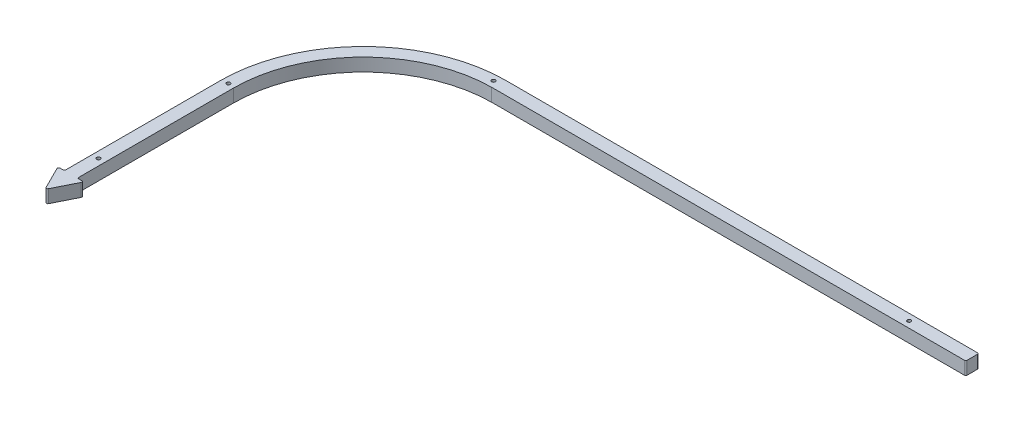
ISO-10303-21;
HEADER;
FILE_DESCRIPTION(('STEP AP214'),'2;1');
FILE_NAME('part.step','',(''),(''),'','','');
FILE_SCHEMA(('AUTOMOTIVE_DESIGN { 1 0 10303 214 1 1 1 1 }'));
ENDSEC;
DATA;
#1=APPLICATION_CONTEXT('core data for automotive mechanical design processes');
#2=APPLICATION_PROTOCOL_DEFINITION('international standard','automotive_design',2000,#1);
#3=PRODUCT_CONTEXT('',#1,'mechanical');
#4=PRODUCT('Part','Part','',(#3));
#5=PRODUCT_RELATED_PRODUCT_CATEGORY('part','',(#4));
#6=PRODUCT_DEFINITION_FORMATION('','',#4);
#7=PRODUCT_DEFINITION_CONTEXT('part definition',#1,'design');
#8=PRODUCT_DEFINITION('design','',#6,#7);
#9=PRODUCT_DEFINITION_SHAPE('','',#8);
#10=(LENGTH_UNIT() NAMED_UNIT(*) SI_UNIT(.MILLI.,.METRE.));
#11=(NAMED_UNIT(*) PLANE_ANGLE_UNIT() SI_UNIT($,.RADIAN.));
#12=(NAMED_UNIT(*) SI_UNIT($,.STERADIAN.) SOLID_ANGLE_UNIT());
#13=UNCERTAINTY_MEASURE_WITH_UNIT(LENGTH_MEASURE(1.E-05),#10,'distance_accuracy_value','');
#14=(GEOMETRIC_REPRESENTATION_CONTEXT(3) GLOBAL_UNCERTAINTY_ASSIGNED_CONTEXT((#13)) GLOBAL_UNIT_ASSIGNED_CONTEXT((#10,
#11,#12)) REPRESENTATION_CONTEXT('',''));
#15=CARTESIAN_POINT('',(0.,0.,0.));
#16=DIRECTION('',(0.,0.,1.));
#17=DIRECTION('',(1.,0.,0.));
#18=AXIS2_PLACEMENT_3D('',#15,#16,#17);
#19=CARTESIAN_POINT('',(0.,6.35,0.));
#20=DIRECTION('',(0.,1.,0.));
#21=DIRECTION('',(0.,0.,1.));
#22=AXIS2_PLACEMENT_3D('',#19,#20,#21);
#23=PLANE('',#22);
#24=CARTESIAN_POINT('',(3.175,6.35,-26.1849031657124));
#25=DIRECTION('',(0.,1.,0.));
#26=DIRECTION('',(0.,0.,1.));
#27=AXIS2_PLACEMENT_3D('',#24,#25,#26);
#28=CIRCLE('',#27,0.889000000000001);
#29=CARTESIAN_POINT('',(3.175,6.35,-25.2959031657124));
#30=VERTEX_POINT('',#29);
#31=EDGE_CURVE('E358',#30,#30,#28,.T.);
#32=ORIENTED_EDGE('',*,*,#31,.F.);
#33=EDGE_LOOP('',(#32));
#34=FACE_BOUND('',#33,.T.);
#35=CARTESIAN_POINT('',(3.17499999999978,6.35,-89.6849031657124));
#36=DIRECTION('',(0.,1.,0.));
#37=DIRECTION('',(0.,0.,1.));
#38=AXIS2_PLACEMENT_3D('',#35,#36,#37);
#39=CIRCLE('',#38,0.888999999999999);
#40=CARTESIAN_POINT('',(3.17499999999978,6.35,-88.7959031657124));
#41=VERTEX_POINT('',#40);
#42=EDGE_CURVE('E352',#41,#41,#39,.T.);
#43=ORIENTED_EDGE('',*,*,#42,.F.);
#44=EDGE_LOOP('',(#43));
#45=FACE_BOUND('',#44,.T.);
#46=CARTESIAN_POINT('',(66.8019999999998,6.35,-155.570446754539));
#47=DIRECTION('',(0.,1.,0.));
#48=DIRECTION('',(0.,0.,1.));
#49=AXIS2_PLACEMENT_3D('',#46,#47,#48);
#50=CIRCLE('',#49,0.889000000000006);
#51=CARTESIAN_POINT('',(66.8019999999998,6.35,-154.681446754539));
#52=VERTEX_POINT('',#51);
#53=EDGE_CURVE('E346',#52,#52,#50,.T.);
#54=ORIENTED_EDGE('',*,*,#53,.F.);
#55=EDGE_LOOP('',(#54));
#56=FACE_BOUND('',#55,.T.);
#57=CARTESIAN_POINT('',(270.002,6.35,-155.570446754539));
#58=DIRECTION('',(0.,1.,0.));
#59=DIRECTION('',(0.,0.,1.));
#60=AXIS2_PLACEMENT_3D('',#57,#58,#59);
#61=CIRCLE('',#60,0.888999999999993);
#62=CARTESIAN_POINT('',(270.002,6.35,-154.681446754539));
#63=VERTEX_POINT('',#62);
#64=EDGE_CURVE('E340',#63,#63,#61,.T.);
#65=ORIENTED_EDGE('',*,*,#64,.F.);
#66=EDGE_LOOP('',(#65));
#67=FACE_BOUND('',#66,.T.);
#68=DIRECTION('',(0.,0.,1.));
#69=VECTOR('',#68,1.);
#70=CARTESIAN_POINT('',(300.846682844601,6.35,0.));
#71=LINE('',#70,#69);
#72=CARTESIAN_POINT('',(300.846682844601,6.35,-158.11066359056));
#73=VERTEX_POINT('',#72);
#74=CARTESIAN_POINT('',(300.846682844601,6.35,-153.030229918519));
#75=VERTEX_POINT('',#74);
#76=EDGE_CURVE('E206',#73,#75,#71,.T.);
#77=ORIENTED_EDGE('',*,*,#76,.F.);
#78=CARTESIAN_POINT('',(300.211682844601,6.35,-158.11066359056));
#79=DIRECTION('',(0.,1.,0.));
#80=DIRECTION('',(0.,0.,1.));
#81=AXIS2_PLACEMENT_3D('',#78,#79,#80);
#82=CIRCLE('',#81,0.635);
#83=CARTESIAN_POINT('',(300.211682844601,6.35,-158.74566359056));
#84=VERTEX_POINT('',#83);
#85=EDGE_CURVE('E274',#73,#84,#82,.T.);
#86=ORIENTED_EDGE('',*,*,#85,.T.);
#87=DIRECTION('',(1.,0.,0.));
#88=VECTOR('',#87,1.);
#89=CARTESIAN_POINT('',(0.,6.35,-158.745663590559));
#90=LINE('',#89,#88);
#91=CARTESIAN_POINT('',(69.071682844601,6.35,-158.745663590559));
#92=VERTEX_POINT('',#91);
#93=EDGE_CURVE('E212',#92,#84,#90,.T.);
#94=ORIENTED_EDGE('',*,*,#93,.F.);
#95=CARTESIAN_POINT('',(69.85,6.35,-88.9));
#96=DIRECTION('',(0.,1.,0.));
#97=DIRECTION('',(0.,0.,1.));
#98=AXIS2_PLACEMENT_3D('',#95,#96,#97);
#99=CIRCLE('',#98,69.85);
#100=CARTESIAN_POINT('',(0.,6.35,-88.9));
#101=VERTEX_POINT('',#100);
#102=EDGE_CURVE('E215',#101,#92,#99,.F.);
#103=ORIENTED_EDGE('',*,*,#102,.F.);
#104=DIRECTION('',(0.,0.,-1.));
#105=VECTOR('',#104,1.);
#106=CARTESIAN_POINT('',(0.,6.35,0.));
#107=LINE('',#106,#105);
#108=CARTESIAN_POINT('',(0.,6.35,-13.335));
#109=VERTEX_POINT('',#108);
#110=EDGE_CURVE('E218',#109,#101,#107,.T.);
#111=ORIENTED_EDGE('',*,*,#110,.F.);
#112=CARTESIAN_POINT('',(-0.635,6.35,-13.335));
#113=DIRECTION('',(0.,1.,0.));
#114=DIRECTION('',(0.,0.,1.));
#115=AXIS2_PLACEMENT_3D('',#112,#113,#114);
#116=CIRCLE('',#115,0.635);
#117=CARTESIAN_POINT('',(-0.635,6.35,-12.7));
#118=VERTEX_POINT('',#117);
#119=EDGE_CURVE('E12',#109,#118,#116,.F.);
#120=ORIENTED_EDGE('',*,*,#119,.T.);
#121=DIRECTION('',(-1.,0.,0.));
#122=VECTOR('',#121,1.);
#123=CARTESIAN_POINT('',(9.525,6.35,-12.7));
#124=LINE('',#123,#122);
#125=CARTESIAN_POINT('',(-2.14754841714382,6.35,-12.7));
#126=VERTEX_POINT('',#125);
#127=EDGE_CURVE('E243',#118,#126,#124,.T.);
#128=ORIENTED_EDGE('',*,*,#127,.T.);
#129=CARTESIAN_POINT('',(-2.14754841714382,6.35,-12.065));
#130=DIRECTION('',(0.,1.,0.));
#131=DIRECTION('',(0.,0.,1.));
#132=AXIS2_PLACEMENT_3D('',#129,#130,#131);
#133=CIRCLE('',#132,0.635);
#134=CARTESIAN_POINT('',(-2.71550968342876,6.35,-11.7810193668575));
#135=VERTEX_POINT('',#134);
#136=EDGE_CURVE('E270',#126,#135,#133,.T.);
#137=ORIENTED_EDGE('',*,*,#136,.T.);
#138=DIRECTION('',(0.447213595499958,0.,0.894427190999916));
#139=VECTOR('',#138,1.);
#140=CARTESIAN_POINT('',(2.54,6.35,-1.27));
#141=LINE('',#140,#139);
#142=CARTESIAN_POINT('',(2.60703873371505,6.35,-1.13592253256989));
#143=VERTEX_POINT('',#142);
#144=EDGE_CURVE('E328',#135,#143,#141,.T.);
#145=ORIENTED_EDGE('',*,*,#144,.T.);
#146=CARTESIAN_POINT('',(3.175,6.35,-1.41990316571237));
#147=DIRECTION('',(0.,1.,0.));
#148=DIRECTION('',(0.,0.,1.));
#149=AXIS2_PLACEMENT_3D('',#146,#147,#148);
#150=CIRCLE('',#149,0.635);
#151=CARTESIAN_POINT('',(3.74296126628495,6.35,-1.13592253256989));
#152=VERTEX_POINT('',#151);
#153=EDGE_CURVE('E266',#143,#152,#150,.T.);
#154=ORIENTED_EDGE('',*,*,#153,.T.);
#155=DIRECTION('',(0.447213595499958,0.,-0.894427190999916));
#156=VECTOR('',#155,1.);
#157=CARTESIAN_POINT('',(2.54,6.35,1.27));
#158=LINE('',#157,#156);
#159=CARTESIAN_POINT('',(9.06550968342877,6.35,-11.7810193668575));
#160=VERTEX_POINT('',#159);
#161=EDGE_CURVE('E334',#152,#160,#158,.T.);
#162=ORIENTED_EDGE('',*,*,#161,.T.);
#163=CARTESIAN_POINT('',(8.49754841714381,6.35,-12.065));
#164=DIRECTION('',(0.,1.,0.));
#165=DIRECTION('',(0.,0.,1.));
#166=AXIS2_PLACEMENT_3D('',#163,#164,#165);
#167=CIRCLE('',#166,0.635);
#168=CARTESIAN_POINT('',(8.49754841714381,6.35,-12.7));
#169=VERTEX_POINT('',#168);
#170=EDGE_CURVE('E268',#160,#169,#167,.T.);
#171=ORIENTED_EDGE('',*,*,#170,.T.);
#172=CARTESIAN_POINT('',(6.985,6.35,-12.7));
#173=VERTEX_POINT('',#172);
#174=EDGE_CURVE('E223',#169,#173,#124,.T.);
#175=ORIENTED_EDGE('',*,*,#174,.T.);
#176=CARTESIAN_POINT('',(6.985,6.35,-13.335));
#177=DIRECTION('',(0.,1.,0.));
#178=DIRECTION('',(0.,0.,1.));
#179=AXIS2_PLACEMENT_3D('',#176,#177,#178);
#180=CIRCLE('',#179,0.635);
#181=CARTESIAN_POINT('',(6.35,6.35,-13.335));
#182=VERTEX_POINT('',#181);
#183=EDGE_CURVE('E185',#173,#182,#180,.F.);
#184=ORIENTED_EDGE('',*,*,#183,.T.);
#185=DIRECTION('',(0.,0.,-1.));
#186=VECTOR('',#185,1.);
#187=CARTESIAN_POINT('',(6.35,6.35,0.));
#188=LINE('',#187,#186);
#189=CARTESIAN_POINT('',(6.35,6.35,-88.9));
#190=VERTEX_POINT('',#189);
#191=EDGE_CURVE('E176',#182,#190,#188,.T.);
#192=ORIENTED_EDGE('',*,*,#191,.T.);
#193=CARTESIAN_POINT('',(69.85,6.35,-88.9));
#194=DIRECTION('',(0.,1.,0.));
#195=DIRECTION('',(0.,0.,1.));
#196=AXIS2_PLACEMENT_3D('',#193,#194,#195);
#197=CIRCLE('',#196,63.5);
#198=CARTESIAN_POINT('',(69.071682844601,6.35,-152.395229918519));
#199=VERTEX_POINT('',#198);
#200=EDGE_CURVE('E181',#190,#199,#197,.F.);
#201=ORIENTED_EDGE('',*,*,#200,.T.);
#202=DIRECTION('',(1.,0.,0.));
#203=VECTOR('',#202,1.);
#204=CARTESIAN_POINT('',(0.,6.35,-152.395229918519));
#205=LINE('',#204,#203);
#206=CARTESIAN_POINT('',(300.211682844601,6.35,-152.395229918519));
#207=VERTEX_POINT('',#206);
#208=EDGE_CURVE('E204',#199,#207,#205,.T.);
#209=ORIENTED_EDGE('',*,*,#208,.T.);
#210=CARTESIAN_POINT('',(300.211682844601,6.35,-153.030229918519));
#211=DIRECTION('',(0.,1.,0.));
#212=DIRECTION('',(0.,0.,1.));
#213=AXIS2_PLACEMENT_3D('',#210,#211,#212);
#214=CIRCLE('',#213,0.635);
#215=EDGE_CURVE('E272',#207,#75,#214,.T.);
#216=ORIENTED_EDGE('',*,*,#215,.T.);
#217=EDGE_LOOP('',(#77,#86,#94,#103,#111,#120,#128,#137,#145,#154,#162,#171,#175,#184,#192,#201,
#209,#216));
#218=FACE_BOUND('',#217,.T.);
#219=ADVANCED_FACE('F53',(#34,#45,#56,#67,#218),#23,.T.);
#220=CARTESIAN_POINT('',(0.,0.,0.));
#221=DIRECTION('',(0.,1.,0.));
#222=DIRECTION('',(0.,0.,1.));
#223=AXIS2_PLACEMENT_3D('',#220,#221,#222);
#224=PLANE('',#223);
#225=CARTESIAN_POINT('',(3.175,0.,-26.1849031657124));
#226=DIRECTION('',(0.,1.,0.));
#227=DIRECTION('',(0.,0.,1.));
#228=AXIS2_PLACEMENT_3D('',#225,#226,#227);
#229=CIRCLE('',#228,0.889000000000001);
#230=CARTESIAN_POINT('',(3.175,0.,-25.2959031657124));
#231=VERTEX_POINT('',#230);
#232=EDGE_CURVE('E337',#231,#231,#229,.T.);
#233=ORIENTED_EDGE('',*,*,#232,.T.);
#234=EDGE_LOOP('',(#233));
#235=FACE_BOUND('',#234,.T.);
#236=CARTESIAN_POINT('',(3.17499999999978,0.,-89.6849031657124));
#237=DIRECTION('',(0.,1.,0.));
#238=DIRECTION('',(0.,0.,1.));
#239=AXIS2_PLACEMENT_3D('',#236,#237,#238);
#240=CIRCLE('',#239,0.888999999999999);
#241=CARTESIAN_POINT('',(3.17499999999978,0.,-88.7959031657124));
#242=VERTEX_POINT('',#241);
#243=EDGE_CURVE('E355',#242,#242,#240,.T.);
#244=ORIENTED_EDGE('',*,*,#243,.T.);
#245=EDGE_LOOP('',(#244));
#246=FACE_BOUND('',#245,.T.);
#247=CARTESIAN_POINT('',(66.8019999999998,0.,-155.570446754539));
#248=DIRECTION('',(0.,1.,0.));
#249=DIRECTION('',(0.,0.,1.));
#250=AXIS2_PLACEMENT_3D('',#247,#248,#249);
#251=CIRCLE('',#250,0.889000000000006);
#252=CARTESIAN_POINT('',(66.8019999999998,0.,-154.681446754539));
#253=VERTEX_POINT('',#252);
#254=EDGE_CURVE('E349',#253,#253,#251,.T.);
#255=ORIENTED_EDGE('',*,*,#254,.T.);
#256=EDGE_LOOP('',(#255));
#257=FACE_BOUND('',#256,.T.);
#258=CARTESIAN_POINT('',(270.002,0.,-155.570446754539));
#259=DIRECTION('',(0.,1.,0.));
#260=DIRECTION('',(0.,0.,1.));
#261=AXIS2_PLACEMENT_3D('',#258,#259,#260);
#262=CIRCLE('',#261,0.888999999999993);
#263=CARTESIAN_POINT('',(270.002,0.,-154.681446754539));
#264=VERTEX_POINT('',#263);
#265=EDGE_CURVE('E343',#264,#264,#262,.T.);
#266=ORIENTED_EDGE('',*,*,#265,.T.);
#267=EDGE_LOOP('',(#266));
#268=FACE_BOUND('',#267,.T.);
#269=DIRECTION('',(1.,0.,0.));
#270=VECTOR('',#269,1.);
#271=CARTESIAN_POINT('',(0.,0.,-158.745663590559));
#272=LINE('',#271,#270);
#273=CARTESIAN_POINT('',(69.071682844601,0.,-158.745663590559));
#274=VERTEX_POINT('',#273);
#275=CARTESIAN_POINT('',(300.211682844601,0.,-158.74566359056));
#276=VERTEX_POINT('',#275);
#277=EDGE_CURVE('E231',#274,#276,#272,.T.);
#278=ORIENTED_EDGE('',*,*,#277,.T.);
#279=CARTESIAN_POINT('',(300.211682844601,0.,-158.11066359056));
#280=DIRECTION('',(0.,1.,0.));
#281=DIRECTION('',(0.,0.,1.));
#282=AXIS2_PLACEMENT_3D('',#279,#280,#281);
#283=CIRCLE('',#282,0.635);
#284=CARTESIAN_POINT('',(300.846682844601,0.,-158.11066359056));
#285=VERTEX_POINT('',#284);
#286=EDGE_CURVE('E259',#276,#285,#283,.F.);
#287=ORIENTED_EDGE('',*,*,#286,.T.);
#288=DIRECTION('',(0.,0.,1.));
#289=VECTOR('',#288,1.);
#290=CARTESIAN_POINT('',(300.846682844601,0.,0.));
#291=LINE('',#290,#289);
#292=CARTESIAN_POINT('',(300.846682844601,0.,-153.030229918519));
#293=VERTEX_POINT('',#292);
#294=EDGE_CURVE('E228',#285,#293,#291,.T.);
#295=ORIENTED_EDGE('',*,*,#294,.T.);
#296=CARTESIAN_POINT('',(300.211682844601,0.,-153.030229918519));
#297=DIRECTION('',(0.,1.,0.));
#298=DIRECTION('',(0.,0.,1.));
#299=AXIS2_PLACEMENT_3D('',#296,#297,#298);
#300=CIRCLE('',#299,0.635);
#301=CARTESIAN_POINT('',(300.211682844601,0.,-152.395229918519));
#302=VERTEX_POINT('',#301);
#303=EDGE_CURVE('E257',#293,#302,#300,.F.);
#304=ORIENTED_EDGE('',*,*,#303,.T.);
#305=DIRECTION('',(1.,0.,0.));
#306=VECTOR('',#305,1.);
#307=CARTESIAN_POINT('',(0.,0.,-152.395229918519));
#308=LINE('',#307,#306);
#309=CARTESIAN_POINT('',(69.071682844601,0.,-152.395229918519));
#310=VERTEX_POINT('',#309);
#311=EDGE_CURVE('E225',#310,#302,#308,.T.);
#312=ORIENTED_EDGE('',*,*,#311,.F.);
#313=CARTESIAN_POINT('',(69.85,0.,-88.9));
#314=DIRECTION('',(0.,1.,0.));
#315=DIRECTION('',(0.,0.,1.));
#316=AXIS2_PLACEMENT_3D('',#313,#314,#315);
#317=CIRCLE('',#316,63.5);
#318=CARTESIAN_POINT('',(6.35,0.,-88.9));
#319=VERTEX_POINT('',#318);
#320=EDGE_CURVE('E222',#319,#310,#317,.F.);
#321=ORIENTED_EDGE('',*,*,#320,.F.);
#322=DIRECTION('',(0.,0.,-1.));
#323=VECTOR('',#322,1.);
#324=CARTESIAN_POINT('',(6.35,0.,0.));
#325=LINE('',#324,#323);
#326=CARTESIAN_POINT('',(6.35,0.,-13.335));
#327=VERTEX_POINT('',#326);
#328=EDGE_CURVE('E195',#327,#319,#325,.T.);
#329=ORIENTED_EDGE('',*,*,#328,.F.);
#330=CARTESIAN_POINT('',(6.985,0.,-13.335));
#331=DIRECTION('',(0.,1.,0.));
#332=DIRECTION('',(0.,0.,1.));
#333=AXIS2_PLACEMENT_3D('',#330,#331,#332);
#334=CIRCLE('',#333,0.635);
#335=CARTESIAN_POINT('',(6.985,0.,-12.7));
#336=VERTEX_POINT('',#335);
#337=EDGE_CURVE('E301',#327,#336,#334,.T.);
#338=ORIENTED_EDGE('',*,*,#337,.T.);
#339=DIRECTION('',(-1.,0.,0.));
#340=VECTOR('',#339,1.);
#341=CARTESIAN_POINT('',(9.525,0.,-12.7));
#342=LINE('',#341,#340);
#343=CARTESIAN_POINT('',(8.49754841714381,0.,-12.7));
#344=VERTEX_POINT('',#343);
#345=EDGE_CURVE('E245',#344,#336,#342,.T.);
#346=ORIENTED_EDGE('',*,*,#345,.F.);
#347=CARTESIAN_POINT('',(8.49754841714381,0.,-12.065));
#348=DIRECTION('',(0.,1.,0.));
#349=DIRECTION('',(0.,0.,1.));
#350=AXIS2_PLACEMENT_3D('',#347,#348,#349);
#351=CIRCLE('',#350,0.635);
#352=CARTESIAN_POINT('',(9.06550968342877,0.,-11.7810193668575));
#353=VERTEX_POINT('',#352);
#354=EDGE_CURVE('E253',#344,#353,#351,.F.);
#355=ORIENTED_EDGE('',*,*,#354,.T.);
#356=DIRECTION('',(0.447213595499958,0.,-0.894427190999916));
#357=VECTOR('',#356,1.);
#358=CARTESIAN_POINT('',(2.54,0.,1.27));
#359=LINE('',#358,#357);
#360=CARTESIAN_POINT('',(3.74296126628495,0.,-1.13592253256989));
#361=VERTEX_POINT('',#360);
#362=EDGE_CURVE('E332',#361,#353,#359,.T.);
#363=ORIENTED_EDGE('',*,*,#362,.F.);
#364=CARTESIAN_POINT('',(3.175,0.,-1.41990316571237));
#365=DIRECTION('',(0.,1.,0.));
#366=DIRECTION('',(0.,0.,1.));
#367=AXIS2_PLACEMENT_3D('',#364,#365,#366);
#368=CIRCLE('',#367,0.635);
#369=CARTESIAN_POINT('',(2.60703873371505,0.,-1.13592253256989));
#370=VERTEX_POINT('',#369);
#371=EDGE_CURVE('E251',#361,#370,#368,.F.);
#372=ORIENTED_EDGE('',*,*,#371,.T.);
#373=DIRECTION('',(0.447213595499958,0.,0.894427190999916));
#374=VECTOR('',#373,1.);
#375=CARTESIAN_POINT('',(2.54,0.,-1.27));
#376=LINE('',#375,#374);
#377=CARTESIAN_POINT('',(-2.71550968342876,0.,-11.7810193668575));
#378=VERTEX_POINT('',#377);
#379=EDGE_CURVE('E326',#378,#370,#376,.T.);
#380=ORIENTED_EDGE('',*,*,#379,.F.);
#381=CARTESIAN_POINT('',(-2.14754841714382,0.,-12.065));
#382=DIRECTION('',(0.,1.,0.));
#383=DIRECTION('',(0.,0.,1.));
#384=AXIS2_PLACEMENT_3D('',#381,#382,#383);
#385=CIRCLE('',#384,0.635);
#386=CARTESIAN_POINT('',(-2.14754841714382,0.,-12.7));
#387=VERTEX_POINT('',#386);
#388=EDGE_CURVE('E255',#378,#387,#385,.F.);
#389=ORIENTED_EDGE('',*,*,#388,.T.);
#390=CARTESIAN_POINT('',(-0.635,0.,-12.7));
#391=VERTEX_POINT('',#390);
#392=EDGE_CURVE('E248',#391,#387,#342,.T.);
#393=ORIENTED_EDGE('',*,*,#392,.F.);
#394=CARTESIAN_POINT('',(-0.635,0.,-13.335));
#395=DIRECTION('',(0.,1.,0.));
#396=DIRECTION('',(0.,0.,1.));
#397=AXIS2_PLACEMENT_3D('',#394,#395,#396);
#398=CIRCLE('',#397,0.635);
#399=CARTESIAN_POINT('',(0.,0.,-13.335));
#400=VERTEX_POINT('',#399);
#401=EDGE_CURVE('E61',#391,#400,#398,.T.);
#402=ORIENTED_EDGE('',*,*,#401,.T.);
#403=DIRECTION('',(0.,0.,-1.));
#404=VECTOR('',#403,1.);
#405=CARTESIAN_POINT('',(0.,0.,0.));
#406=LINE('',#405,#404);
#407=CARTESIAN_POINT('',(0.,0.,-88.9));
#408=VERTEX_POINT('',#407);
#409=EDGE_CURVE('E189',#400,#408,#406,.T.);
#410=ORIENTED_EDGE('',*,*,#409,.T.);
#411=CARTESIAN_POINT('',(69.85,0.,-88.9));
#412=DIRECTION('',(0.,1.,0.));
#413=DIRECTION('',(0.,0.,1.));
#414=AXIS2_PLACEMENT_3D('',#411,#412,#413);
#415=CIRCLE('',#414,69.85);
#416=EDGE_CURVE('E234',#408,#274,#415,.F.);
#417=ORIENTED_EDGE('',*,*,#416,.T.);
#418=EDGE_LOOP('',(#278,#287,#295,#304,#312,#321,#329,#338,#346,#355,#363,#372,#380,#389,#393,
#402,#410,#417));
#419=FACE_BOUND('',#418,.T.);
#420=ADVANCED_FACE('F306',(#235,#246,#257,#268,#419),#224,.F.);
#421=CARTESIAN_POINT('',(6.35,6.35,0.));
#422=DIRECTION('',(-1.,0.,0.));
#423=DIRECTION('',(0.,0.,1.));
#424=AXIS2_PLACEMENT_3D('',#421,#422,#423);
#425=PLANE('',#424);
#426=ORIENTED_EDGE('',*,*,#191,.F.);
#427=DIRECTION('',(0.,-1.,0.));
#428=VECTOR('',#427,1.);
#429=CARTESIAN_POINT('',(6.35,0.,-13.335));
#430=LINE('',#429,#428);
#431=EDGE_CURVE('E278',#182,#327,#430,.T.);
#432=ORIENTED_EDGE('',*,*,#431,.T.);
#433=ORIENTED_EDGE('',*,*,#328,.T.);
#434=DIRECTION('',(0.,-1.,0.));
#435=VECTOR('',#434,1.);
#436=CARTESIAN_POINT('',(6.35,6.35,-88.9));
#437=LINE('',#436,#435);
#438=EDGE_CURVE('E192',#190,#319,#437,.T.);
#439=ORIENTED_EDGE('',*,*,#438,.F.);
#440=EDGE_LOOP('',(#426,#432,#433,#439));
#441=FACE_BOUND('',#440,.T.);
#442=ADVANCED_FACE('F193',(#441),#425,.F.);
#443=CARTESIAN_POINT('',(69.85,6.35,-88.9));
#444=DIRECTION('',(0.,-1.,0.));
#445=DIRECTION('',(0.,0.,-1.));
#446=AXIS2_PLACEMENT_3D('',#443,#444,#445);
#447=CYLINDRICAL_SURFACE('',#446,63.5);
#448=ORIENTED_EDGE('',*,*,#320,.T.);
#449=DIRECTION('',(0.,-1.,0.));
#450=VECTOR('',#449,1.);
#451=CARTESIAN_POINT('',(69.071682844601,6.35,-152.395229918519));
#452=LINE('',#451,#450);
#453=EDGE_CURVE('E199',#199,#310,#452,.T.);
#454=ORIENTED_EDGE('',*,*,#453,.F.);
#455=ORIENTED_EDGE('',*,*,#200,.F.);
#456=ORIENTED_EDGE('',*,*,#438,.T.);
#457=EDGE_LOOP('',(#448,#454,#455,#456));
#458=FACE_BOUND('',#457,.T.);
#459=ADVANCED_FACE('F201',(#458),#447,.F.);
#460=CARTESIAN_POINT('',(0.,6.35,-152.395229918519));
#461=DIRECTION('',(0.,0.,-1.));
#462=DIRECTION('',(-1.,0.,0.));
#463=AXIS2_PLACEMENT_3D('',#460,#461,#462);
#464=PLANE('',#463);
#465=ORIENTED_EDGE('',*,*,#311,.T.);
#466=DIRECTION('',(0.,-1.,0.));
#467=VECTOR('',#466,1.);
#468=CARTESIAN_POINT('',(300.211682844601,6.35,-152.395229918519));
#469=LINE('',#468,#467);
#470=EDGE_CURVE('E276',#302,#207,#469,.F.);
#471=ORIENTED_EDGE('',*,*,#470,.T.);
#472=ORIENTED_EDGE('',*,*,#208,.F.);
#473=ORIENTED_EDGE('',*,*,#453,.T.);
#474=EDGE_LOOP('',(#465,#471,#472,#473));
#475=FACE_BOUND('',#474,.T.);
#476=ADVANCED_FACE('F421',(#475),#464,.F.);
#477=CARTESIAN_POINT('',(300.846682844601,6.35,0.));
#478=DIRECTION('',(1.,0.,0.));
#479=DIRECTION('',(0.,0.,-1.));
#480=AXIS2_PLACEMENT_3D('',#477,#478,#479);
#481=PLANE('',#480);
#482=ORIENTED_EDGE('',*,*,#294,.F.);
#483=DIRECTION('',(0.,-1.,0.));
#484=VECTOR('',#483,1.);
#485=CARTESIAN_POINT('',(300.846682844601,6.35,-158.11066359056));
#486=LINE('',#485,#484);
#487=EDGE_CURVE('E264',#285,#73,#486,.F.);
#488=ORIENTED_EDGE('',*,*,#487,.T.);
#489=ORIENTED_EDGE('',*,*,#76,.T.);
#490=DIRECTION('',(0.,-1.,0.));
#491=VECTOR('',#490,1.);
#492=CARTESIAN_POINT('',(300.846682844601,0.,-153.030229918519));
#493=LINE('',#492,#491);
#494=EDGE_CURVE('E261',#75,#293,#493,.T.);
#495=ORIENTED_EDGE('',*,*,#494,.T.);
#496=EDGE_LOOP('',(#482,#488,#489,#495));
#497=FACE_BOUND('',#496,.T.);
#498=ADVANCED_FACE('F417',(#497),#481,.T.);
#499=CARTESIAN_POINT('',(0.,6.35,-158.745663590559));
#500=DIRECTION('',(0.,0.,-1.));
#501=DIRECTION('',(-1.,0.,0.));
#502=AXIS2_PLACEMENT_3D('',#499,#500,#501);
#503=PLANE('',#502);
#504=ORIENTED_EDGE('',*,*,#93,.T.);
#505=DIRECTION('',(0.,-1.,0.));
#506=VECTOR('',#505,1.);
#507=CARTESIAN_POINT('',(300.211682844601,6.35,-158.74566359056));
#508=LINE('',#507,#506);
#509=EDGE_CURVE('E198',#84,#276,#508,.T.);
#510=ORIENTED_EDGE('',*,*,#509,.T.);
#511=ORIENTED_EDGE('',*,*,#277,.F.);
#512=DIRECTION('',(0.,-1.,0.));
#513=VECTOR('',#512,1.);
#514=CARTESIAN_POINT('',(69.071682844601,6.35,-158.745663590559));
#515=LINE('',#514,#513);
#516=EDGE_CURVE('E240',#92,#274,#515,.T.);
#517=ORIENTED_EDGE('',*,*,#516,.F.);
#518=EDGE_LOOP('',(#504,#510,#511,#517));
#519=FACE_BOUND('',#518,.T.);
#520=ADVANCED_FACE('F413',(#519),#503,.T.);
#521=CARTESIAN_POINT('',(69.85,6.35,-88.9));
#522=DIRECTION('',(0.,-1.,0.));
#523=DIRECTION('',(0.,0.,-1.));
#524=AXIS2_PLACEMENT_3D('',#521,#522,#523);
#525=CYLINDRICAL_SURFACE('',#524,69.85);
#526=ORIENTED_EDGE('',*,*,#416,.F.);
#527=DIRECTION('',(0.,-1.,0.));
#528=VECTOR('',#527,1.);
#529=CARTESIAN_POINT('',(0.,6.35,-88.9));
#530=LINE('',#529,#528);
#531=EDGE_CURVE('E220',#101,#408,#530,.T.);
#532=ORIENTED_EDGE('',*,*,#531,.F.);
#533=ORIENTED_EDGE('',*,*,#102,.T.);
#534=ORIENTED_EDGE('',*,*,#516,.T.);
#535=EDGE_LOOP('',(#526,#532,#533,#534));
#536=FACE_BOUND('',#535,.T.);
#537=ADVANCED_FACE('F410',(#536),#525,.T.);
#538=CARTESIAN_POINT('',(0.,6.35,0.));
#539=DIRECTION('',(-1.,0.,0.));
#540=DIRECTION('',(0.,0.,1.));
#541=AXIS2_PLACEMENT_3D('',#538,#539,#540);
#542=PLANE('',#541);
#543=ORIENTED_EDGE('',*,*,#409,.F.);
#544=DIRECTION('',(0.,-1.,0.));
#545=VECTOR('',#544,1.);
#546=CARTESIAN_POINT('',(0.,6.35,-13.335));
#547=LINE('',#546,#545);
#548=EDGE_CURVE('E289',#400,#109,#547,.F.);
#549=ORIENTED_EDGE('',*,*,#548,.T.);
#550=ORIENTED_EDGE('',*,*,#110,.T.);
#551=ORIENTED_EDGE('',*,*,#531,.T.);
#552=EDGE_LOOP('',(#543,#549,#550,#551));
#553=FACE_BOUND('',#552,.T.);
#554=ADVANCED_FACE('F311',(#553),#542,.T.);
#555=CARTESIAN_POINT('',(9.525,6.35,-12.7));
#556=DIRECTION('',(0.,0.,1.));
#557=DIRECTION('',(1.,0.,0.));
#558=AXIS2_PLACEMENT_3D('',#555,#556,#557);
#559=PLANE('',#558);
#560=ORIENTED_EDGE('',*,*,#127,.F.);
#561=DIRECTION('',(0.,-1.,0.));
#562=VECTOR('',#561,1.);
#563=CARTESIAN_POINT('',(-0.635,6.35,-12.7));
#564=LINE('',#563,#562);
#565=EDGE_CURVE('E286',#118,#391,#564,.T.);
#566=ORIENTED_EDGE('',*,*,#565,.T.);
#567=ORIENTED_EDGE('',*,*,#392,.T.);
#568=DIRECTION('',(0.,-1.,0.));
#569=VECTOR('',#568,1.);
#570=CARTESIAN_POINT('',(-2.14754841714382,6.35,-12.7));
#571=LINE('',#570,#569);
#572=EDGE_CURVE('E68',#387,#126,#571,.F.);
#573=ORIENTED_EDGE('',*,*,#572,.T.);
#574=EDGE_LOOP('',(#560,#566,#567,#573));
#575=FACE_BOUND('',#574,.T.);
#576=ADVANCED_FACE('F315',(#575),#559,.F.);
#577=ORIENTED_EDGE('',*,*,#345,.T.);
#578=DIRECTION('',(0.,-1.,0.));
#579=VECTOR('',#578,1.);
#580=CARTESIAN_POINT('',(6.985,6.35,-12.7));
#581=LINE('',#580,#579);
#582=EDGE_CURVE('E283',#336,#173,#581,.F.);
#583=ORIENTED_EDGE('',*,*,#582,.T.);
#584=ORIENTED_EDGE('',*,*,#174,.F.);
#585=DIRECTION('',(0.,-1.,0.));
#586=VECTOR('',#585,1.);
#587=CARTESIAN_POINT('',(8.49754841714381,0.,-12.7));
#588=LINE('',#587,#586);
#589=EDGE_CURVE('E280',#169,#344,#588,.T.);
#590=ORIENTED_EDGE('',*,*,#589,.T.);
#591=EDGE_LOOP('',(#577,#583,#584,#590));
#592=FACE_BOUND('',#591,.T.);
#593=ADVANCED_FACE('F404',(#592),#559,.F.);
#594=CARTESIAN_POINT('',(2.54,0.,-1.27));
#595=DIRECTION('',(-0.894427190999916,0.,0.447213595499958));
#596=DIRECTION('',(0.447213595499958,0.,0.894427190999916));
#597=AXIS2_PLACEMENT_3D('',#594,#595,#596);
#598=PLANE('',#597);
#599=ORIENTED_EDGE('',*,*,#144,.F.);
#600=DIRECTION('',(0.,-1.,0.));
#601=VECTOR('',#600,1.);
#602=CARTESIAN_POINT('',(-2.71550968342876,0.,-11.7810193668575));
#603=LINE('',#602,#601);
#604=EDGE_CURVE('E294',#135,#378,#603,.T.);
#605=ORIENTED_EDGE('',*,*,#604,.T.);
#606=ORIENTED_EDGE('',*,*,#379,.T.);
#607=DIRECTION('',(0.,1.,0.));
#608=VECTOR('',#607,1.);
#609=CARTESIAN_POINT('',(2.60703873371505,0.,-1.13592253256989));
#610=LINE('',#609,#608);
#611=EDGE_CURVE('E291',#370,#143,#610,.T.);
#612=ORIENTED_EDGE('',*,*,#611,.T.);
#613=EDGE_LOOP('',(#599,#605,#606,#612));
#614=FACE_BOUND('',#613,.T.);
#615=ADVANCED_FACE('F325',(#614),#598,.T.);
#616=CARTESIAN_POINT('',(2.54,0.,1.27));
#617=DIRECTION('',(0.894427190999916,0.,0.447213595499958));
#618=DIRECTION('',(0.447213595499958,0.,-0.894427190999916));
#619=AXIS2_PLACEMENT_3D('',#616,#617,#618);
#620=PLANE('',#619);
#621=ORIENTED_EDGE('',*,*,#362,.T.);
#622=DIRECTION('',(0.,-1.,0.));
#623=VECTOR('',#622,1.);
#624=CARTESIAN_POINT('',(9.06550968342876,6.35,-11.7810193668575));
#625=LINE('',#624,#623);
#626=EDGE_CURVE('E299',#353,#160,#625,.F.);
#627=ORIENTED_EDGE('',*,*,#626,.T.);
#628=ORIENTED_EDGE('',*,*,#161,.F.);
#629=DIRECTION('',(0.,1.,0.));
#630=VECTOR('',#629,1.);
#631=CARTESIAN_POINT('',(3.74296126628495,0.,-1.13592253256989));
#632=LINE('',#631,#630);
#633=EDGE_CURVE('E297',#152,#361,#632,.F.);
#634=ORIENTED_EDGE('',*,*,#633,.T.);
#635=EDGE_LOOP('',(#621,#627,#628,#634));
#636=FACE_BOUND('',#635,.T.);
#637=ADVANCED_FACE('F398',(#636),#620,.T.);
#638=CARTESIAN_POINT('',(300.211682844601,6.35,-158.11066359056));
#639=DIRECTION('',(0.,-1.,0.));
#640=DIRECTION('',(0.,0.,-1.));
#641=AXIS2_PLACEMENT_3D('',#638,#639,#640);
#642=CYLINDRICAL_SURFACE('',#641,0.635);
#643=ORIENTED_EDGE('',*,*,#85,.F.);
#644=ORIENTED_EDGE('',*,*,#487,.F.);
#645=ORIENTED_EDGE('',*,*,#286,.F.);
#646=ORIENTED_EDGE('',*,*,#509,.F.);
#647=EDGE_LOOP('',(#643,#644,#645,#646));
#648=FACE_BOUND('',#647,.T.);
#649=ADVANCED_FACE('F401',(#648),#642,.T.);
#650=CARTESIAN_POINT('',(300.211682844601,6.35,-153.030229918519));
#651=DIRECTION('',(0.,1.,0.));
#652=DIRECTION('',(0.,0.,1.));
#653=AXIS2_PLACEMENT_3D('',#650,#651,#652);
#654=CYLINDRICAL_SURFACE('',#653,0.635);
#655=ORIENTED_EDGE('',*,*,#215,.F.);
#656=ORIENTED_EDGE('',*,*,#470,.F.);
#657=ORIENTED_EDGE('',*,*,#303,.F.);
#658=ORIENTED_EDGE('',*,*,#494,.F.);
#659=EDGE_LOOP('',(#655,#656,#657,#658));
#660=FACE_BOUND('',#659,.T.);
#661=ADVANCED_FACE('F435',(#660),#654,.T.);
#662=CARTESIAN_POINT('',(6.985,6.35,-13.335));
#663=DIRECTION('',(0.,1.,0.));
#664=DIRECTION('',(0.,0.,1.));
#665=AXIS2_PLACEMENT_3D('',#662,#663,#664);
#666=CYLINDRICAL_SURFACE('',#665,0.635);
#667=ORIENTED_EDGE('',*,*,#183,.F.);
#668=ORIENTED_EDGE('',*,*,#582,.F.);
#669=ORIENTED_EDGE('',*,*,#337,.F.);
#670=ORIENTED_EDGE('',*,*,#431,.F.);
#671=EDGE_LOOP('',(#667,#668,#669,#670));
#672=FACE_BOUND('',#671,.T.);
#673=ADVANCED_FACE('F439',(#672),#666,.F.);
#674=CARTESIAN_POINT('',(-0.635,6.35,-13.335));
#675=DIRECTION('',(0.,-1.,0.));
#676=DIRECTION('',(0.,0.,-1.));
#677=AXIS2_PLACEMENT_3D('',#674,#675,#676);
#678=CYLINDRICAL_SURFACE('',#677,0.635);
#679=ORIENTED_EDGE('',*,*,#119,.F.);
#680=ORIENTED_EDGE('',*,*,#548,.F.);
#681=ORIENTED_EDGE('',*,*,#401,.F.);
#682=ORIENTED_EDGE('',*,*,#565,.F.);
#683=EDGE_LOOP('',(#679,#680,#681,#682));
#684=FACE_BOUND('',#683,.T.);
#685=ADVANCED_FACE('F314',(#684),#678,.F.);
#686=CARTESIAN_POINT('',(-2.14754841714382,0.,-12.065));
#687=DIRECTION('',(0.,1.,0.));
#688=DIRECTION('',(0.,0.,1.));
#689=AXIS2_PLACEMENT_3D('',#686,#687,#688);
#690=CYLINDRICAL_SURFACE('',#689,0.635);
#691=ORIENTED_EDGE('',*,*,#136,.F.);
#692=ORIENTED_EDGE('',*,*,#572,.F.);
#693=ORIENTED_EDGE('',*,*,#388,.F.);
#694=ORIENTED_EDGE('',*,*,#604,.F.);
#695=EDGE_LOOP('',(#691,#692,#693,#694));
#696=FACE_BOUND('',#695,.T.);
#697=ADVANCED_FACE('F321',(#696),#690,.T.);
#698=CARTESIAN_POINT('',(8.49754841714381,6.35,-12.065));
#699=DIRECTION('',(0.,1.,0.));
#700=DIRECTION('',(0.,0.,1.));
#701=AXIS2_PLACEMENT_3D('',#698,#699,#700);
#702=CYLINDRICAL_SURFACE('',#701,0.635);
#703=ORIENTED_EDGE('',*,*,#170,.F.);
#704=ORIENTED_EDGE('',*,*,#626,.F.);
#705=ORIENTED_EDGE('',*,*,#354,.F.);
#706=ORIENTED_EDGE('',*,*,#589,.F.);
#707=EDGE_LOOP('',(#703,#704,#705,#706));
#708=FACE_BOUND('',#707,.T.);
#709=ADVANCED_FACE('F393',(#708),#702,.T.);
#710=CARTESIAN_POINT('',(3.175,0.,-1.41990316571237));
#711=DIRECTION('',(0.,1.,0.));
#712=DIRECTION('',(0.,0.,1.));
#713=AXIS2_PLACEMENT_3D('',#710,#711,#712);
#714=CYLINDRICAL_SURFACE('',#713,0.635);
#715=ORIENTED_EDGE('',*,*,#371,.F.);
#716=ORIENTED_EDGE('',*,*,#633,.F.);
#717=ORIENTED_EDGE('',*,*,#153,.F.);
#718=ORIENTED_EDGE('',*,*,#611,.F.);
#719=EDGE_LOOP('',(#715,#716,#717,#718));
#720=FACE_BOUND('',#719,.T.);
#721=ADVANCED_FACE('F55',(#720),#714,.T.);
#722=CARTESIAN_POINT('',(270.002,0.,-155.570446754539));
#723=DIRECTION('',(0.,1.,0.));
#724=DIRECTION('',(0.,0.,1.));
#725=AXIS2_PLACEMENT_3D('',#722,#723,#724);
#726=CYLINDRICAL_SURFACE('',#725,0.888999999999993);
#727=ORIENTED_EDGE('',*,*,#265,.F.);
#728=EDGE_LOOP('',(#727));
#729=FACE_BOUND('',#728,.T.);
#730=ORIENTED_EDGE('',*,*,#64,.T.);
#731=EDGE_LOOP('',(#730));
#732=FACE_BOUND('',#731,.T.);
#733=ADVANCED_FACE('F382',(#729,#732),#726,.F.);
#734=CARTESIAN_POINT('',(66.8019999999998,0.,-155.570446754539));
#735=DIRECTION('',(0.,1.,0.));
#736=DIRECTION('',(0.,0.,1.));
#737=AXIS2_PLACEMENT_3D('',#734,#735,#736);
#738=CYLINDRICAL_SURFACE('',#737,0.889000000000006);
#739=ORIENTED_EDGE('',*,*,#254,.F.);
#740=EDGE_LOOP('',(#739));
#741=FACE_BOUND('',#740,.T.);
#742=ORIENTED_EDGE('',*,*,#53,.T.);
#743=EDGE_LOOP('',(#742));
#744=FACE_BOUND('',#743,.T.);
#745=ADVANCED_FACE('F384',(#741,#744),#738,.F.);
#746=CARTESIAN_POINT('',(3.17499999999978,0.,-89.6849031657124));
#747=DIRECTION('',(0.,1.,0.));
#748=DIRECTION('',(0.,0.,1.));
#749=AXIS2_PLACEMENT_3D('',#746,#747,#748);
#750=CYLINDRICAL_SURFACE('',#749,0.888999999999999);
#751=ORIENTED_EDGE('',*,*,#243,.F.);
#752=EDGE_LOOP('',(#751));
#753=FACE_BOUND('',#752,.T.);
#754=ORIENTED_EDGE('',*,*,#42,.T.);
#755=EDGE_LOOP('',(#754));
#756=FACE_BOUND('',#755,.T.);
#757=ADVANCED_FACE('F369',(#753,#756),#750,.F.);
#758=CARTESIAN_POINT('',(3.175,0.,-26.1849031657124));
#759=DIRECTION('',(0.,1.,0.));
#760=DIRECTION('',(0.,0.,1.));
#761=AXIS2_PLACEMENT_3D('',#758,#759,#760);
#762=CYLINDRICAL_SURFACE('',#761,0.889000000000001);
#763=ORIENTED_EDGE('',*,*,#232,.F.);
#764=EDGE_LOOP('',(#763));
#765=FACE_BOUND('',#764,.T.);
#766=ORIENTED_EDGE('',*,*,#31,.T.);
#767=EDGE_LOOP('',(#766));
#768=FACE_BOUND('',#767,.T.);
#769=ADVANCED_FACE('F366',(#765,#768),#762,.F.);
#770=CLOSED_SHELL('',(#219,#420,#442,#459,#476,#498,#520,#537,#554,#576,#593,#615,#637,#649,
#661,#673,#685,#697,#709,#721,#733,#745,#757,#769));
#771=MANIFOLD_SOLID_BREP('B2',#770);
#772=ADVANCED_BREP_SHAPE_REPRESENTATION('',(#18,#771),#14);
#773=SHAPE_DEFINITION_REPRESENTATION(#9,#772);
ENDSEC;
END-ISO-10303-21;
